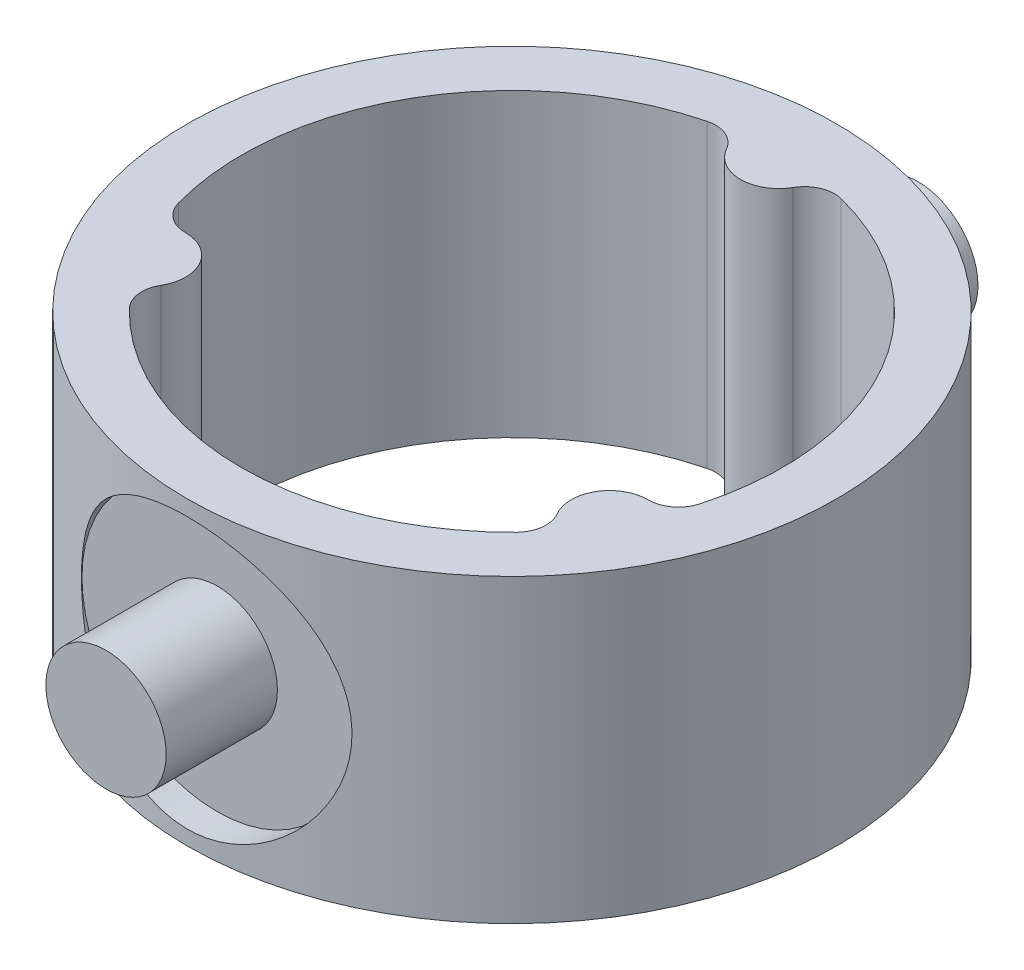
ISO-10303-21;
HEADER;
FILE_DESCRIPTION(('STEP AP214'),'2;1');
FILE_NAME('part.step','',(''),(''),'','','');
FILE_SCHEMA(('AUTOMOTIVE_DESIGN { 1 0 10303 214 1 1 1 1 }'));
ENDSEC;
DATA;
#1=APPLICATION_CONTEXT('core data for automotive mechanical design processes');
#2=APPLICATION_PROTOCOL_DEFINITION('international standard','automotive_design',2000,#1);
#3=PRODUCT_CONTEXT('',#1,'mechanical');
#4=PRODUCT('Part','Part','',(#3));
#5=PRODUCT_RELATED_PRODUCT_CATEGORY('part','',(#4));
#6=PRODUCT_DEFINITION_FORMATION('','',#4);
#7=PRODUCT_DEFINITION_CONTEXT('part definition',#1,'design');
#8=PRODUCT_DEFINITION('design','',#6,#7);
#9=PRODUCT_DEFINITION_SHAPE('','',#8);
#10=(LENGTH_UNIT() NAMED_UNIT(*) SI_UNIT(.MILLI.,.METRE.));
#11=(NAMED_UNIT(*) PLANE_ANGLE_UNIT() SI_UNIT($,.RADIAN.));
#12=(NAMED_UNIT(*) SI_UNIT($,.STERADIAN.) SOLID_ANGLE_UNIT());
#13=UNCERTAINTY_MEASURE_WITH_UNIT(LENGTH_MEASURE(1.E-05),#10,'distance_accuracy_value','');
#14=(GEOMETRIC_REPRESENTATION_CONTEXT(3) GLOBAL_UNCERTAINTY_ASSIGNED_CONTEXT((#13)) GLOBAL_UNIT_ASSIGNED_CONTEXT((#10,
#11,#12)) REPRESENTATION_CONTEXT('',''));
#15=CARTESIAN_POINT('',(0.,0.,0.));
#16=DIRECTION('',(0.,0.,1.));
#17=DIRECTION('',(1.,0.,0.));
#18=AXIS2_PLACEMENT_3D('',#15,#16,#17);
#19=CARTESIAN_POINT('',(0.,-2.5,0.));
#20=DIRECTION('',(0.,1.,0.));
#21=DIRECTION('',(0.,0.,1.));
#22=AXIS2_PLACEMENT_3D('',#19,#20,#21);
#23=CYLINDRICAL_SURFACE('',#22,10.8);
#24=CARTESIAN_POINT('',(0.,7.5,0.));
#25=DIRECTION('',(0.,1.,0.));
#26=DIRECTION('',(0.,0.,1.));
#27=AXIS2_PLACEMENT_3D('',#24,#25,#26);
#28=CIRCLE('',#27,10.8);
#29=CARTESIAN_POINT('',(0.,7.5,10.8));
#30=VERTEX_POINT('',#29);
#31=EDGE_CURVE('E173',#30,#30,#28,.T.);
#32=ORIENTED_EDGE('',*,*,#31,.F.);
#33=EDGE_LOOP('',(#32));
#34=FACE_BOUND('',#33,.T.);
#35=CARTESIAN_POINT('',(0.,-2.5,0.));
#36=DIRECTION('',(0.,1.,0.));
#37=DIRECTION('',(0.,0.,1.));
#38=AXIS2_PLACEMENT_3D('',#35,#36,#37);
#39=CIRCLE('',#38,10.8);
#40=CARTESIAN_POINT('',(0.,-2.5,10.8));
#41=VERTEX_POINT('',#40);
#42=EDGE_CURVE('E176',#41,#41,#39,.T.);
#43=ORIENTED_EDGE('',*,*,#42,.T.);
#44=EDGE_LOOP('',(#43));
#45=FACE_BOUND('',#44,.T.);
#46=CARTESIAN_POINT('',(4.5,2.48878162270595,-9.81784090317214));
#47=CARTESIAN_POINT('',(4.499999130687,2.36872034971407,-9.81784178922771));
#48=CARTESIAN_POINT('',(4.49518786657701,2.24861607583283,-9.82005098185499));
#49=CARTESIAN_POINT('',(4.4759928446243,2.00928289692781,-9.8288145489474));
#50=CARTESIAN_POINT('',(4.46160283761734,1.89005461477417,-9.83537176004558));
#51=CARTESIAN_POINT('',(4.42336403189235,1.65315729466913,-9.85262874117904));
#52=CARTESIAN_POINT('',(4.39949513498688,1.53549212240891,-9.86333731222912));
#53=CARTESIAN_POINT('',(4.34256093138144,1.30280588620721,-9.88853489592547));
#54=CARTESIAN_POINT('',(4.30949175507021,1.18778595693413,-9.90302549912465));
#55=CARTESIAN_POINT('',(4.19727317572978,0.848890394585216,-9.95136091190686));
#56=CARTESIAN_POINT('',(4.10490895957135,0.629938869941857,-9.99016726914596));
#57=CARTESIAN_POINT('',(3.88801174977117,0.210811776086538,-10.0765519108709));
#58=CARTESIAN_POINT('',(3.7634863657861,0.0106317805931158,-10.12412811956));
#59=CARTESIAN_POINT('',(3.47751786827545,-0.377975650228928,-10.2260052021657));
#60=CARTESIAN_POINT('',(3.31438805183078,-0.56510249569064,-10.2805340479398));
#61=CARTESIAN_POINT('',(2.95924162431949,-0.910362280249201,-10.3883210387722));
#62=CARTESIAN_POINT('',(2.767213927272,-1.06848404035776,-10.4415786870417));
#63=CARTESIAN_POINT('',(2.45645909184913,-1.28383997884884,-10.5175053123368));
#64=CARTESIAN_POINT('',(2.34653720651238,-1.35318486540874,-10.5426331121591));
#65=CARTESIAN_POINT('',(2.12070579322386,-1.4823012298353,-10.5903680945871));
#66=CARTESIAN_POINT('',(2.00479873864298,-1.54207662107928,-10.6129763064052));
#67=CARTESIAN_POINT('',(1.76774565997795,-1.65152337780657,-10.6550256866174));
#68=CARTESIAN_POINT('',(1.64659915355632,-1.70119381062872,-10.6744665626417));
#69=CARTESIAN_POINT('',(1.40000523929313,-1.78990291367461,-10.7095976367687));
#70=CARTESIAN_POINT('',(1.27456001192321,-1.82894688672622,-10.7252897051261));
#71=CARTESIAN_POINT('',(1.02687359272432,-1.89426277870306,-10.7517549390501));
#72=CARTESIAN_POINT('',(0.904801371641997,-1.9210900419917,-10.762740238292));
#73=CARTESIAN_POINT('',(0.658605309623306,-1.96451542101854,-10.7806058238914));
#74=CARTESIAN_POINT('',(0.534482407476133,-1.98111809118572,-10.7874879379226));
#75=CARTESIAN_POINT('',(0.28513832143866,-2.00391995217642,-10.7969560406787));
#76=CARTESIAN_POINT('',(0.159917291580193,-2.01012057932942,-10.7995426225367));
#77=CARTESIAN_POINT('',(-0.090617099456184,-2.01204936483073,-10.8003462078145));
#78=CARTESIAN_POINT('',(-0.215930456868742,-2.00777792892519,-10.7985633805297));
#79=CARTESIAN_POINT('',(-0.457987944553301,-1.9893951608201,-10.7909222946683));
#80=CARTESIAN_POINT('',(-0.57478765236829,-1.97590127065178,-10.7853198158807));
#81=CARTESIAN_POINT('',(-0.806783152984606,-1.93986231433349,-10.7704511541539));
#82=CARTESIAN_POINT('',(-0.921978402133852,-1.91731425394038,-10.7611837592306));
#83=CARTESIAN_POINT('',(-1.14991246184237,-1.86339106547157,-10.7392178244333));
#84=CARTESIAN_POINT('',(-1.26265207245534,-1.83201886011533,-10.7265204206965));
#85=CARTESIAN_POINT('',(-1.48500851607678,-1.76073651786461,-10.6980066759271));
#86=CARTESIAN_POINT('',(-1.59462413942044,-1.72082312322955,-10.6821891450108));
#87=CARTESIAN_POINT('',(-1.9209654729284,-1.58743694603114,-10.6300855741452));
#88=CARTESIAN_POINT('',(-2.13190932091022,-1.48109724255699,-10.5894788184313));
#89=CARTESIAN_POINT('',(-2.53339889169575,-1.23776071699913,-10.5006823805653));
#90=CARTESIAN_POINT('',(-2.72393737029233,-1.10075306033037,-10.452490020309));
#91=CARTESIAN_POINT('',(-3.09361197591048,-0.788734734418552,-10.3493437248));
#92=CARTESIAN_POINT('',(-3.27099765235869,-0.611726029513683,-10.2941526262098));
#93=CARTESIAN_POINT('',(-3.59437462400636,-0.230217874793637,-10.1857561525098));
#94=CARTESIAN_POINT('',(-3.74035380458734,-0.0257078659872551,-10.13255155018));
#95=CARTESIAN_POINT('',(-3.93484444183958,0.301574683671118,-10.0579343819606));
#96=CARTESIAN_POINT('',(-3.99637965613973,0.416122295158072,-10.0335773277464));
#97=CARTESIAN_POINT('',(-4.10948974638993,0.650573878972761,-9.98778329616452));
#98=CARTESIAN_POINT('',(-4.16106895689269,0.77047549220087,-9.96634504923679));
#99=CARTESIAN_POINT('',(-4.25376395270496,1.01481785509324,-9.92713597099844));
#100=CARTESIAN_POINT('',(-4.29488113447666,1.13925799642094,-9.90936465028972));
#101=CARTESIAN_POINT('',(-4.36618886300561,1.39170219382132,-9.8781532967137));
#102=CARTESIAN_POINT('',(-4.39638516574454,1.51970433407265,-9.86471098260148));
#103=CARTESIAN_POINT('',(-4.44391709996353,1.76992303041591,-9.84338529706079));
#104=CARTESIAN_POINT('',(-4.46195648046842,1.89198040336973,-9.83519935698869));
#105=CARTESIAN_POINT('',(-4.48794972221711,2.13733236448446,-9.82336567120448));
#106=CARTESIAN_POINT('',(-4.49590814609084,2.26062636746198,-9.81971587245388));
#107=CARTESIAN_POINT('',(-4.5016543912487,2.50748906397633,-9.81708296000969));
#108=CARTESIAN_POINT('',(-4.49944318775422,2.63105773003836,-9.81809939884495));
#109=CARTESIAN_POINT('',(-4.48488101317492,2.87746563868149,-9.82475982928858));
#110=CARTESIAN_POINT('',(-4.47253034506305,3.00030490294706,-9.83040368262717));
#111=CARTESIAN_POINT('',(-4.43895445734497,3.23642544873868,-9.84560811682289));
#112=CARTESIAN_POINT('',(-4.41835116550924,3.34981329340097,-9.85489341541523));
#113=CARTESIAN_POINT('',(-4.36861200004651,3.57435683052016,-9.87704207818052));
#114=CARTESIAN_POINT('',(-4.33947333071349,3.68551177883932,-9.88990661463962));
#115=CARTESIAN_POINT('',(-4.23963907732574,4.0145231100116,-9.93331757979694));
#116=CARTESIAN_POINT('',(-4.15649929560167,4.22810563727014,-9.96869385735817));
#117=CARTESIAN_POINT('',(-3.95558430550482,4.6474315524122,-10.0501501020971));
#118=CARTESIAN_POINT('',(-3.83649140799269,4.85245989529592,-10.096619920115));
#119=CARTESIAN_POINT('',(-3.56832201446919,5.24064224408336,-10.1944800538007));
#120=CARTESIAN_POINT('',(-3.41923254130026,5.4237867277165,-10.2458724940407));
#121=CARTESIAN_POINT('',(-3.08105051623623,5.77846063229159,-10.352829169303));
#122=CARTESIAN_POINT('',(-2.88968944312654,5.94783073276201,-10.4083924290975));
#123=CARTESIAN_POINT('',(-2.47982278026785,6.25249780476487,-10.5135658553975));
#124=CARTESIAN_POINT('',(-2.2613152029377,6.38779227918974,-10.563175585481));
#125=CARTESIAN_POINT('',(-1.91722415243838,6.56197646625842,-10.6291135605005));
#126=CARTESIAN_POINT('',(-1.79956917229354,6.61531789085612,-10.6497107698095));
#127=CARTESIAN_POINT('',(-1.55964717719427,6.71183609549408,-10.6874789596443));
#128=CARTESIAN_POINT('',(-1.43738217267275,6.75501724828375,-10.7046514136199));
#129=CARTESIAN_POINT('',(-1.18916760994523,6.83075349004096,-10.7350602510965));
#130=CARTESIAN_POINT('',(-1.0632190505358,6.86331143091485,-10.748297690906));
#131=CARTESIAN_POINT('',(-0.808609729980778,6.91744765562998,-10.7704443034055));
#132=CARTESIAN_POINT('',(-0.679949172854654,6.93902676234395,-10.7793538004762));
#133=CARTESIAN_POINT('',(-0.430094953099462,6.96982335661635,-10.7921061370254));
#134=CARTESIAN_POINT('',(-0.309010349424316,6.97980157355936,-10.7962604577301));
#135=CARTESIAN_POINT('',(-0.0663153643766298,6.98993218898005,-10.8004784305491));
#136=CARTESIAN_POINT('',(0.0552951799556565,6.99008128555518,-10.8005407080207));
#137=CARTESIAN_POINT('',(0.297995615592964,6.98054515421752,-10.796569876915));
#138=CARTESIAN_POINT('',(0.419085752672342,6.97086523890223,-10.792538980705));
#139=CARTESIAN_POINT('',(0.659935177231045,6.94178132095816,-10.7804931157975));
#140=CARTESIAN_POINT('',(0.779693952141744,6.92237369727812,-10.772476663522));
#141=CARTESIAN_POINT('',(1.01269290930705,6.8749043137203,-10.7530283939932));
#142=CARTESIAN_POINT('',(1.12601270552566,6.84717852597485,-10.7417296296167));
#143=CARTESIAN_POINT('',(1.34983658694246,6.78313978902401,-10.715907013341));
#144=CARTESIAN_POINT('',(1.460339674232,6.74682384206455,-10.701382035681));
#145=CARTESIAN_POINT('',(1.78652819561143,6.62545172133989,-10.6534708536598));
#146=CARTESIAN_POINT('',(1.99708339058819,6.5279320085756,-10.6157316553714));
#147=CARTESIAN_POINT('',(2.40852507201608,6.29760737863984,-10.5302067513327));
#148=CARTESIAN_POINT('',(2.60854454520066,6.16340697756063,-10.4820440889146));
#149=CARTESIAN_POINT('',(2.98409265039456,5.86556812898232,-10.3813786702613));
#150=CARTESIAN_POINT('',(3.15961214750949,5.7019187531233,-10.3288743067662));
#151=CARTESIAN_POINT('',(3.49364238385786,5.3365401766519,-10.2209271583355));
#152=CARTESIAN_POINT('',(3.65018302902976,5.13297752912544,-10.1655275359292));
#153=CARTESIAN_POINT('',(3.8577979853947,4.80910966041488,-10.0877591957318));
#154=CARTESIAN_POINT('',(3.92251430085463,4.69796262635783,-10.0627056516199));
#155=CARTESIAN_POINT('',(4.04237972601622,4.47012125067664,-10.0151543724791));
#156=CARTESIAN_POINT('',(4.0975331944591,4.35342946741121,-9.99265547466616));
#157=CARTESIAN_POINT('',(4.19753634865144,4.11581268701835,-9.95106086139921));
#158=CARTESIAN_POINT('',(4.24243466602216,3.99491094149114,-9.93194918420965));
#159=CARTESIAN_POINT('',(4.32179340568547,3.7492382045854,-9.89767505680287));
#160=CARTESIAN_POINT('',(4.35625894456926,3.62446914307795,-9.88251067121175));
#161=CARTESIAN_POINT('',(4.41430153556168,3.37231894462411,-9.85672104789654));
#162=CARTESIAN_POINT('',(4.4379073361442,3.24494564747837,-9.84608383127355));
#163=CARTESIAN_POINT('',(4.47405247770753,2.98839317650951,-9.82971277973737));
#164=CARTESIAN_POINT('',(4.48660042579225,2.85921548687903,-9.8239751312539));
#165=CARTESIAN_POINT('',(4.49569604617058,2.68961496083608,-9.81981256465333));
#166=CARTESIAN_POINT('',(4.4973095691615,2.64947053417844,-9.8190736773051));
#167=CARTESIAN_POINT('',(4.49946169649934,2.56914621852537,-9.81808769602092));
#168=CARTESIAN_POINT('',(4.5000002909605,2.5289663292072,-9.81784060660788));
#169=CARTESIAN_POINT('',(4.5,2.48878162270595,-9.81784090317214));
#170=B_SPLINE_CURVE_WITH_KNOTS('',3,(#46,#47,#48,#49,#50,#51,#52,#53,#54,#55,#56,#57,#58,#59,
#60,#61,#62,#63,#64,#65,#66,#67,#68,#69,#70,#71,#72,#73,#74,#75,#76,#77,#78,#79,#80,#81,#82,#83,
#84,#85,#86,#87,#88,#89,#90,#91,#92,#93,#94,#95,#96,#97,#98,#99,#100,#101,#102,#103,#104,#105,
#106,#107,#108,#109,#110,#111,#112,#113,#114,#115,#116,#117,#118,#119,#120,#121,#122,#123,#124,
#125,#126,#127,#128,#129,#130,#131,#132,#133,#134,#135,#136,#137,#138,#139,#140,#141,#142,#143,
#144,#145,#146,#147,#148,#149,#150,#151,#152,#153,#154,#155,#156,#157,#158,#159,#160,#161,#162,
#163,#164,#165,#166,#167,#168,#169),.UNSPECIFIED.,.T.,.F.,(4,2,2,2,2,2,2,2,2,2,2,2,2,2,2,2,2,2,
2,2,2,2,2,2,2,2,2,2,2,2,2,2,2,2,2,2,2,2,2,2,2,2,2,2,2,2,2,2,2,2,2,2,2,2,2,2,2,2,2,2,2,4),(0.,
0.360141692400153,0.720518571533897,1.08166367646993,1.44296090824064,2.16182147335641,
2.88051210438917,3.63975741711234,4.39929474216559,4.79599605504564,5.1925347230286,
5.58910997390208,5.9854869609778,6.36139895681738,6.73714338558021,7.1128359267246,
7.48851391167379,7.84122788546848,8.19405859909573,8.54677258602487,8.8996213440283,
9.61535071580285,10.3313333455699,11.0977845351619,11.8645308446497,12.2609771471852,
12.6572504573572,13.0534708455432,13.44948209558,13.8199568081931,14.1902637843756,
14.5605352505301,14.9307956531662,15.2772401588601,15.6237982672733,16.3163751177775,
17.0382823943445,17.7605026575272,18.5415176873689,19.3225899343976,19.7146008882865,
20.1064428197344,20.4981794706219,20.8898867561957,21.2541261375292,21.618487877402,
21.9826527839157,22.3469533482985,22.6981655193966,23.0495004361909,23.7515915016356,
24.4854125567227,25.2195064926379,26.0035528635865,26.396253267933,26.7887742063725,
27.1793932013458,27.5698203118634,27.9592078299316,28.3482919919343,28.4688309030526,
28.5893709227219),.UNSPECIFIED.);
#171=CARTESIAN_POINT('',(4.5,2.48878162270595,-9.81784090317214));
#172=VERTEX_POINT('',#171);
#173=EDGE_CURVE('E226',#172,#172,#170,.T.);
#174=ORIENTED_EDGE('',*,*,#173,.F.);
#175=EDGE_LOOP('',(#174));
#176=FACE_BOUND('',#175,.T.);
#177=CARTESIAN_POINT('',(0.,-2.01121837729405,10.8));
#178=CARTESIAN_POINT('',(-0.120574082460596,-2.01121756003427,10.7999993458434));
#179=CARTESIAN_POINT('',(-0.241188950368004,-2.00636575253238,10.7979752875037));
#180=CARTESIAN_POINT('',(-0.481559849203685,-1.98700373992877,10.7899295249166));
#181=CARTESIAN_POINT('',(-0.60131528816404,-1.97248742305257,10.7839052909898));
#182=CARTESIAN_POINT('',(-0.839275581237151,-1.93390667040113,10.768001771357));
#183=CARTESIAN_POINT('',(-0.957476740688243,-1.90982266302778,10.7581145843111));
#184=CARTESIAN_POINT('',(-1.1912734086126,-1.85234365267924,10.7347417359283));
#185=CARTESIAN_POINT('',(-1.30686783122598,-1.81894484424346,10.72125460397));
#186=CARTESIAN_POINT('',(-1.5341993911699,-1.7433008830199,10.6910861666311));
#187=CARTESIAN_POINT('',(-1.64594959716117,-1.7010900737902,10.6744172826815));
#188=CARTESIAN_POINT('',(-1.86537837610477,-1.6081178179564,10.638268514392));
#189=CARTESIAN_POINT('',(-1.97305540815876,-1.55735317424117,10.6187875794017));
#190=CARTESIAN_POINT('',(-2.28885932275931,-1.39288497014229,10.5568449178338));
#191=CARTESIAN_POINT('',(-2.49006383986557,-1.26690486813539,10.5108409721634));
#192=CARTESIAN_POINT('',(-2.87804584264689,-0.979348518645932,10.4114794226615));
#193=CARTESIAN_POINT('',(-3.0637380245867,-0.81640440635858,10.3578812833438));
#194=CARTESIAN_POINT('',(-3.40618589993601,-0.462236015237614,10.2503715396276));
#195=CARTESIAN_POINT('',(-3.56292635744277,-0.270996940919809,10.196459785494));
#196=CARTESIAN_POINT('',(-3.7767844507323,0.0387329262644708,10.1184024246455));
#197=CARTESIAN_POINT('',(-3.84586849552686,0.148653244156109,10.0922773256918));
#198=CARTESIAN_POINT('',(-3.97446736749641,0.374435059284382,10.0423283818193));
#199=CARTESIAN_POINT('',(-4.0339861542166,0.490294071862373,10.0185035863273));
#200=CARTESIAN_POINT('',(-4.14294141890078,0.727235202258029,9.97394137396134));
#201=CARTESIAN_POINT('',(-4.19237745515302,0.848317548621528,9.95320409235785));
#202=CARTESIAN_POINT('',(-4.28064868825705,1.09480538874047,9.91556104229413));
#203=CARTESIAN_POINT('',(-4.31948933505338,1.22020862243309,9.89865330479588));
#204=CARTESIAN_POINT('',(-4.38456242952077,1.46835438758209,9.86999575864018));
#205=CARTESIAN_POINT('',(-4.41130804691534,1.59093836746799,9.8580383340799));
#206=CARTESIAN_POINT('',(-4.4544915347756,1.83820704584183,9.83860091686521));
#207=CARTESIAN_POINT('',(-4.47093416889249,1.96289074608684,9.83111885507054));
#208=CARTESIAN_POINT('',(-4.49332253950478,2.21336003390348,9.82090652821701));
#209=CARTESIAN_POINT('',(-4.49927098369659,2.33914532882298,9.81817503742496));
#210=CARTESIAN_POINT('',(-4.50060293062115,2.59077837044722,9.81756455982488));
#211=CARTESIAN_POINT('',(-4.49598698947528,2.71662611351596,9.81968531758891));
#212=CARTESIAN_POINT('',(-4.47700900230672,2.95767027146309,9.82835132197387));
#213=CARTESIAN_POINT('',(-4.46342430202013,3.07294108132158,9.83454352354727));
#214=CARTESIAN_POINT('',(-4.42745811178658,3.30183722179444,9.85078629077822));
#215=CARTESIAN_POINT('',(-4.40507374501833,3.41546200167377,9.86083811821468));
#216=CARTESIAN_POINT('',(-4.32502840324777,3.75265594589069,9.8963445279658));
#217=CARTESIAN_POINT('',(-4.25445908543001,3.97274417063242,9.92715801478711));
#218=CARTESIAN_POINT('',(-4.07958567017749,4.40242506294458,10.0003028872635));
#219=CARTESIAN_POINT('',(-3.97459567371488,4.61169473396364,10.0428654134389));
#220=CARTESIAN_POINT('',(-3.73432603511191,5.01049186491548,10.1346598577841));
#221=CARTESIAN_POINT('',(-3.59903444790385,5.20001149597519,10.1838944030725));
#222=CARTESIAN_POINT('',(-3.28858508332836,5.57074436863949,10.2885471866942));
#223=CARTESIAN_POINT('',(-3.11102443428177,5.74990204160969,10.3441363756894));
#224=CARTESIAN_POINT('',(-2.7278266330754,6.07658945686123,10.4517242269214));
#225=CARTESIAN_POINT('',(-2.52218292241034,6.22411179029312,10.5037220461474));
#226=CARTESIAN_POINT('',(-2.08241258624484,6.48635080308796,10.5997782094909));
#227=CARTESIAN_POINT('',(-1.84773808947183,6.60023168388703,10.6436255960897));
#228=CARTESIAN_POINT('',(-1.36026865643235,6.78617766667151,10.7168213304035));
#229=CARTESIAN_POINT('',(-1.10748382157786,6.85826587846898,10.7461776897881));
#230=CARTESIAN_POINT('',(-0.608141207750658,6.95427921238012,10.7855870833287));
#231=CARTESIAN_POINT('',(-0.362200632294698,6.98096192786966,10.7967434796293));
#232=CARTESIAN_POINT('',(0.130876765075994,6.99362800935575,10.8020178113426));
#233=CARTESIAN_POINT('',(0.378013223202344,6.97962306018785,10.7961406385207));
#234=CARTESIAN_POINT('',(0.853553652040939,6.91328577007884,10.7687238424062));
#235=CARTESIAN_POINT('',(1.08227860515053,6.86288997684305,10.7479759668333));
#236=CARTESIAN_POINT('',(1.52777797105663,6.72789593344825,10.6937498191942));
#237=CARTESIAN_POINT('',(1.74455087013444,6.64329336228167,10.6602699388502));
#238=CARTESIAN_POINT('',(2.16759211220403,6.43952683498352,10.5824978377736));
#239=CARTESIAN_POINT('',(2.37332496500643,6.31937090694797,10.5379020507931));
#240=CARTESIAN_POINT('',(2.76244746656075,6.04898671794073,10.4426566067986));
#241=CARTESIAN_POINT('',(2.9458277352223,5.89874590149194,10.392004425807));
#242=CARTESIAN_POINT('',(3.29879599256221,5.5599409715669,10.285636597715));
#243=CARTESIAN_POINT('',(3.46646171356857,5.36940538610698,10.2298177850298));
#244=CARTESIAN_POINT('',(3.76802824894943,4.96186264557471,10.1226305946415));
#245=CARTESIAN_POINT('',(3.90192139538208,4.7448494954311,10.0712632293581));
#246=CARTESIAN_POINT('',(4.07512574896637,4.4019295459753,10.0018642819867));
#247=CARTESIAN_POINT('',(4.12855099241518,4.28376099291936,9.97987011352927));
#248=CARTESIAN_POINT('',(4.22516253630493,4.04275287961812,9.93935352296125));
#249=CARTESIAN_POINT('',(4.26835334334903,3.91991540302732,9.92082957353939));
#250=CARTESIAN_POINT('',(4.34401970268368,3.67050652854582,9.88793188480419));
#251=CARTESIAN_POINT('',(4.37650018530481,3.54393687801804,9.87355623626702));
#252=CARTESIAN_POINT('',(4.43038424760336,3.28802292334045,9.84949592581877));
#253=CARTESIAN_POINT('',(4.4517888690532,3.15867888133638,9.83981082273025));
#254=CARTESIAN_POINT('',(4.48202687255038,2.90839717082882,9.82607177900605));
#255=CARTESIAN_POINT('',(4.491703145897,2.78758134984083,9.82164085226429));
#256=CARTESIAN_POINT('',(4.50127476076263,2.54543705541208,9.81725800630024));
#257=CARTESIAN_POINT('',(4.50116682858521,2.42410842396782,9.81730758621024));
#258=CARTESIAN_POINT('',(4.49116467704502,2.18200617598769,9.82188725710472));
#259=CARTESIAN_POINT('',(4.48127559876716,2.06123230136801,9.82641499431725));
#260=CARTESIAN_POINT('',(4.45183127868416,1.8210677248557,9.83978955872549));
#261=CARTESIAN_POINT('',(4.43227239356962,1.70167756167186,9.84863801382988));
#262=CARTESIAN_POINT('',(4.38484739739312,1.47077320069273,9.86984063744414));
#263=CARTESIAN_POINT('',(4.35741530324562,1.35915268816209,9.88201033227098));
#264=CARTESIAN_POINT('',(4.2942321082673,1.13869342047709,9.90962924266346));
#265=CARTESIAN_POINT('',(4.25847813694366,1.02985563958928,9.9250795896737));
#266=CARTESIAN_POINT('',(4.13918053256737,0.708527447818413,9.97570545284133));
#267=CARTESIAN_POINT('',(4.04356744713983,0.501059752712437,10.0151717018636));
#268=CARTESIAN_POINT('',(3.81635829247831,0.0922405167870214,10.1040133864555));
#269=CARTESIAN_POINT('',(3.68294431479189,-0.107993196968912,10.1538419564375));
#270=CARTESIAN_POINT('',(3.38647534385777,-0.484300442911821,10.2565305464088));
#271=CARTESIAN_POINT('',(3.22341007288603,-0.660365560534364,10.3093916131588));
#272=CARTESIAN_POINT('',(2.85800581524318,-0.996577071602383,10.416836596008));
#273=CARTESIAN_POINT('',(2.65367141027522,-1.15463009543404,10.4712655834305));
#274=CARTESIAN_POINT('',(2.32825162147272,-1.36426685728298,10.5466464125933));
#275=CARTESIAN_POINT('',(2.21652567458091,-1.42961438763484,10.5707468108104));
#276=CARTESIAN_POINT('',(1.98743544023867,-1.55063054324843,10.6161999011848));
#277=CARTESIAN_POINT('',(1.87007378424898,-1.60630363073967,10.6375538589199));
#278=CARTESIAN_POINT('',(1.63241825785586,-1.70664297489514,10.67658588495));
#279=CARTESIAN_POINT('',(1.51220149333641,-1.75147128965452,10.6943173660995));
#280=CARTESIAN_POINT('',(1.26797492119147,-1.83079134594822,10.7260145434384));
#281=CARTESIAN_POINT('',(1.14396694352134,-1.86528799023325,10.739982025465));
#282=CARTESIAN_POINT('',(0.893386646731148,-1.92351576780858,10.7637197608376));
#283=CARTESIAN_POINT('',(0.766821479844887,-1.94727348721823,10.7735003762985));
#284=CARTESIAN_POINT('',(0.511922254516761,-1.98385646477143,10.7886148838032));
#285=CARTESIAN_POINT('',(0.383589565012367,-1.99668974782812,10.7939520398764));
#286=CARTESIAN_POINT('',(0.212499822285201,-2.00639957257543,10.7979929640834));
#287=CARTESIAN_POINT('',(0.170025127077283,-2.00820613388554,10.7987451957735));
#288=CARTESIAN_POINT('',(0.0850353120228752,-2.01061568207058,10.7997488297924));
#289=CARTESIAN_POINT('',(0.0425201920609744,-2.01121866549896,10.8000002306869));
#290=CARTESIAN_POINT('',(0.,-2.01121837729405,10.8));
#291=B_SPLINE_CURVE_WITH_KNOTS('',3,(#177,#178,#179,#180,#181,#182,#183,#184,#185,#186,#187,
#188,#189,#190,#191,#192,#193,#194,#195,#196,#197,#198,#199,#200,#201,#202,#203,#204,#205,#206,
#207,#208,#209,#210,#211,#212,#213,#214,#215,#216,#217,#218,#219,#220,#221,#222,#223,#224,#225,
#226,#227,#228,#229,#230,#231,#232,#233,#234,#235,#236,#237,#238,#239,#240,#241,#242,#243,#244,
#245,#246,#247,#248,#249,#250,#251,#252,#253,#254,#255,#256,#257,#258,#259,#260,#261,#262,#263,
#264,#265,#266,#267,#268,#269,#270,#271,#272,#273,#274,#275,#276,#277,#278,#279,#280,#281,#282,
#283,#284,#285,#286,#287,#288,#289,#290),.UNSPECIFIED.,.T.,.F.,(4,2,2,2,2,2,2,2,2,2,2,2,2,2,2,2,
2,2,2,2,2,2,2,2,2,2,2,2,2,2,2,2,2,2,2,2,2,2,2,2,2,2,2,2,2,2,2,2,2,2,2,2,2,2,2,2,4),(0.,
0.36167896007413,0.723586861163467,1.08623892225324,1.44903935847162,1.81045137967541,
2.17199878436342,2.89413209017144,3.64939382389778,4.40505189023349,4.80192787576723,
5.19863914867557,5.59536779724044,5.99189199427438,6.36949609148927,6.74692547192359,
7.12425745429923,7.50156957394274,7.84984570078445,8.19823578223054,8.8944225931685,
9.60542379310257,10.3167057688083,11.0880992035931,11.859673098314,12.6490561051781,
13.4380021948475,14.1770540851459,14.915893752743,15.6180673534748,16.3203296806531,
17.0444069927867,17.7687871198907,18.5449356920435,19.3212603276411,19.7154336025095,
20.1094329843294,20.5032507406616,20.8970314485803,21.2604139968556,21.6239181297129,
21.9872313020204,22.3506814648831,22.6970361550415,23.0435104919915,23.7359649114821,
24.4700552555679,25.204400536594,25.9922303534361,26.3867945518146,26.7811762759773,
27.1692392938598,27.5571178689855,27.9440308505505,28.3306593662665,28.4582043120368,
28.5857496230433),.UNSPECIFIED.);
#292=CARTESIAN_POINT('',(0.,-2.01121837729405,10.8));
#293=VERTEX_POINT('',#292);
#294=EDGE_CURVE('E39',#293,#293,#291,.T.);
#295=ORIENTED_EDGE('',*,*,#294,.T.);
#296=EDGE_LOOP('',(#295));
#297=FACE_BOUND('',#296,.T.);
#298=ADVANCED_FACE('F35',(#34,#45,#176,#297),#23,.T.);
#299=CARTESIAN_POINT('',(0.,-2.5,0.));
#300=DIRECTION('',(0.,1.,0.));
#301=DIRECTION('',(0.,0.,1.));
#302=AXIS2_PLACEMENT_3D('',#299,#300,#301);
#303=PLANE('',#302);
#304=ORIENTED_EDGE('',*,*,#42,.F.);
#305=EDGE_LOOP('',(#304));
#306=FACE_BOUND('',#305,.T.);
#307=CARTESIAN_POINT('',(7.68600342189929,-2.5,4.43751614462594));
#308=DIRECTION('',(0.,-1.,0.));
#309=DIRECTION('',(0.,0.,1.));
#310=AXIS2_PLACEMENT_3D('',#307,#308,#309);
#311=CIRCLE('',#310,1.27503228925188);
#312=CARTESIAN_POINT('',(6.58616787272934,-2.5,5.08255033241518));
#313=VERTEX_POINT('',#312);
#314=CARTESIAN_POINT('',(7.69470164024926,-2.5,3.16251352516493));
#315=VERTEX_POINT('',#314);
#316=EDGE_CURVE('E291',#313,#315,#311,.T.);
#317=ORIENTED_EDGE('',*,*,#316,.T.);
#318=CARTESIAN_POINT('',(7.70152359952298,-2.5,2.16253679499984));
#319=DIRECTION('',(0.,1.,0.));
#320=DIRECTION('',(0.,0.,1.));
#321=AXIS2_PLACEMENT_3D('',#318,#319,#320);
#322=CIRCLE('',#321,1.);
#323=CARTESIAN_POINT('',(8.66428903418213,-2.5,2.43287494958699));
#324=VERTEX_POINT('',#323);
#325=EDGE_CURVE('E141',#315,#324,#322,.T.);
#326=ORIENTED_EDGE('',*,*,#325,.T.);
#327=CARTESIAN_POINT('',(0.,-2.5,0.));
#328=DIRECTION('',(0.,1.,0.));
#329=DIRECTION('',(0.,0.,1.));
#330=AXIS2_PLACEMENT_3D('',#327,#328,#329);
#331=CIRCLE('',#330,8.99937692221948);
#332=CARTESIAN_POINT('',(2.22521300651794,-2.5,-8.71993188412616));
#333=VERTEX_POINT('',#332);
#334=EDGE_CURVE('E149',#324,#333,#331,.T.);
#335=ORIENTED_EDGE('',*,*,#334,.T.);
#336=CARTESIAN_POINT('',(1.97794999867305,-2.5,-7.75098348253219));
#337=DIRECTION('',(0.,1.,0.));
#338=DIRECTION('',(0.,0.,1.));
#339=AXIS2_PLACEMENT_3D('',#336,#337,#338);
#340=CIRCLE('',#339,1.);
#341=CARTESIAN_POINT('',(1.10853376751992,-2.5,-8.24506385758011));
#342=VERTEX_POINT('',#341);
#343=EDGE_CURVE('E11',#333,#342,#340,.T.);
#344=ORIENTED_EDGE('',*,*,#343,.T.);
#345=CARTESIAN_POINT('',(0.,-2.5,-8.87503228925188));
#346=DIRECTION('',(0.,-1.,0.));
#347=DIRECTION('',(0.,0.,1.));
#348=AXIS2_PLACEMENT_3D('',#345,#346,#347);
#349=CIRCLE('',#348,1.27503228925188);
#350=CARTESIAN_POINT('',(-1.10853376751992,-2.5,-8.24506385758011));
#351=VERTEX_POINT('',#350);
#352=EDGE_CURVE('E170',#342,#351,#349,.T.);
#353=ORIENTED_EDGE('',*,*,#352,.T.);
#354=CARTESIAN_POINT('',(-1.97794999867304,-2.5,-7.75098348253219));
#355=DIRECTION('',(0.,1.,0.));
#356=DIRECTION('',(0.,0.,1.));
#357=AXIS2_PLACEMENT_3D('',#354,#355,#356);
#358=CIRCLE('',#357,1.);
#359=CARTESIAN_POINT('',(-2.22521300651794,-2.5,-8.71993188412616));
#360=VERTEX_POINT('',#359);
#361=EDGE_CURVE('E224',#351,#360,#358,.T.);
#362=ORIENTED_EDGE('',*,*,#361,.T.);
#363=CARTESIAN_POINT('',(0.,-2.5,0.));
#364=DIRECTION('',(0.,1.,0.));
#365=DIRECTION('',(0.,0.,1.));
#366=AXIS2_PLACEMENT_3D('',#363,#364,#365);
#367=CIRCLE('',#366,8.99937692221948);
#368=CARTESIAN_POINT('',(-8.66428903418213,-2.5,2.43287494958699));
#369=VERTEX_POINT('',#368);
#370=EDGE_CURVE('E155',#360,#369,#367,.T.);
#371=ORIENTED_EDGE('',*,*,#370,.T.);
#372=CARTESIAN_POINT('',(-7.70152359952298,-2.5,2.16253679499984));
#373=DIRECTION('',(0.,1.,0.));
#374=DIRECTION('',(0.,0.,1.));
#375=AXIS2_PLACEMENT_3D('',#372,#373,#374);
#376=CIRCLE('',#375,1.);
#377=CARTESIAN_POINT('',(-7.69470164024926,-2.5,3.16251352516493));
#378=VERTEX_POINT('',#377);
#379=EDGE_CURVE('E220',#369,#378,#376,.T.);
#380=ORIENTED_EDGE('',*,*,#379,.T.);
#381=CARTESIAN_POINT('',(-7.6860034218993,-2.5,4.43751614462594));
#382=DIRECTION('',(0.,-1.,0.));
#383=DIRECTION('',(0.,0.,1.));
#384=AXIS2_PLACEMENT_3D('',#381,#382,#383);
#385=CIRCLE('',#384,1.27503228925188);
#386=CARTESIAN_POINT('',(-6.58616787272934,-2.5,5.08255033241517));
#387=VERTEX_POINT('',#386);
#388=EDGE_CURVE('E159',#378,#387,#385,.T.);
#389=ORIENTED_EDGE('',*,*,#388,.T.);
#390=CARTESIAN_POINT('',(-5.72357360084994,-2.5,5.58844668753235));
#391=DIRECTION('',(0.,1.,0.));
#392=DIRECTION('',(0.,0.,1.));
#393=AXIS2_PLACEMENT_3D('',#390,#391,#392);
#394=CIRCLE('',#393,1.);
#395=CARTESIAN_POINT('',(-6.43907602766419,-2.5,6.28705693453916));
#396=VERTEX_POINT('',#395);
#397=EDGE_CURVE('E216',#387,#396,#394,.T.);
#398=ORIENTED_EDGE('',*,*,#397,.T.);
#399=CARTESIAN_POINT('',(0.,-2.5,0.));
#400=DIRECTION('',(0.,1.,0.));
#401=DIRECTION('',(0.,0.,1.));
#402=AXIS2_PLACEMENT_3D('',#399,#400,#401);
#403=CIRCLE('',#402,8.99937692221948);
#404=CARTESIAN_POINT('',(6.43907602766418,-2.5,6.28705693453917));
#405=VERTEX_POINT('',#404);
#406=EDGE_CURVE('E295',#396,#405,#403,.T.);
#407=ORIENTED_EDGE('',*,*,#406,.T.);
#408=CARTESIAN_POINT('',(5.72357360084994,-2.5,5.58844668753235));
#409=DIRECTION('',(0.,1.,0.));
#410=DIRECTION('',(0.,0.,1.));
#411=AXIS2_PLACEMENT_3D('',#408,#409,#410);
#412=CIRCLE('',#411,1.);
#413=EDGE_CURVE('E212',#405,#313,#412,.T.);
#414=ORIENTED_EDGE('',*,*,#413,.T.);
#415=EDGE_LOOP('',(#317,#326,#335,#344,#353,#362,#371,#380,#389,#398,#407,#414));
#416=FACE_BOUND('',#415,.T.);
#417=ADVANCED_FACE('F280',(#306,#416),#303,.F.);
#418=CARTESIAN_POINT('',(0.,7.5,0.));
#419=DIRECTION('',(0.,1.,0.));
#420=DIRECTION('',(0.,0.,1.));
#421=AXIS2_PLACEMENT_3D('',#418,#419,#420);
#422=PLANE('',#421);
#423=ORIENTED_EDGE('',*,*,#31,.T.);
#424=EDGE_LOOP('',(#423));
#425=FACE_BOUND('',#424,.T.);
#426=CARTESIAN_POINT('',(0.,7.5,-8.87503228925188));
#427=DIRECTION('',(0.,1.,0.));
#428=DIRECTION('',(0.,0.,1.));
#429=AXIS2_PLACEMENT_3D('',#426,#427,#428);
#430=CIRCLE('',#429,1.27503228925188);
#431=CARTESIAN_POINT('',(1.10853376751992,7.5,-8.24506385758011));
#432=VERTEX_POINT('',#431);
#433=CARTESIAN_POINT('',(-1.10853376751992,7.5,-8.24506385758011));
#434=VERTEX_POINT('',#433);
#435=EDGE_CURVE('E184',#432,#434,#430,.F.);
#436=ORIENTED_EDGE('',*,*,#435,.F.);
#437=CARTESIAN_POINT('',(1.97794999867305,7.5,-7.75098348253219));
#438=DIRECTION('',(0.,1.,0.));
#439=DIRECTION('',(0.,0.,1.));
#440=AXIS2_PLACEMENT_3D('',#437,#438,#439);
#441=CIRCLE('',#440,1.);
#442=CARTESIAN_POINT('',(2.22521300651794,7.5,-8.71993188412616));
#443=VERTEX_POINT('',#442);
#444=EDGE_CURVE('E49',#432,#443,#441,.F.);
#445=ORIENTED_EDGE('',*,*,#444,.T.);
#446=CARTESIAN_POINT('',(0.,7.5,0.));
#447=DIRECTION('',(0.,1.,0.));
#448=DIRECTION('',(0.,0.,1.));
#449=AXIS2_PLACEMENT_3D('',#446,#447,#448);
#450=CIRCLE('',#449,8.99937692221948);
#451=CARTESIAN_POINT('',(8.66428903418213,7.5,2.43287494958699));
#452=VERTEX_POINT('',#451);
#453=EDGE_CURVE('E147',#452,#443,#450,.T.);
#454=ORIENTED_EDGE('',*,*,#453,.F.);
#455=CARTESIAN_POINT('',(7.70152359952298,7.5,2.16253679499984));
#456=DIRECTION('',(0.,1.,0.));
#457=DIRECTION('',(0.,0.,1.));
#458=AXIS2_PLACEMENT_3D('',#455,#456,#457);
#459=CIRCLE('',#458,1.);
#460=CARTESIAN_POINT('',(7.69470164024926,7.5,3.16251352516493));
#461=VERTEX_POINT('',#460);
#462=EDGE_CURVE('E131',#452,#461,#459,.F.);
#463=ORIENTED_EDGE('',*,*,#462,.T.);
#464=CARTESIAN_POINT('',(7.68600342189929,7.5,4.43751614462594));
#465=DIRECTION('',(0.,1.,0.));
#466=DIRECTION('',(0.,0.,1.));
#467=AXIS2_PLACEMENT_3D('',#464,#465,#466);
#468=CIRCLE('',#467,1.27503228925188);
#469=CARTESIAN_POINT('',(6.58616787272934,7.5,5.08255033241518));
#470=VERTEX_POINT('',#469);
#471=EDGE_CURVE('E182',#470,#461,#468,.F.);
#472=ORIENTED_EDGE('',*,*,#471,.F.);
#473=CARTESIAN_POINT('',(5.72357360084994,7.5,5.58844668753235));
#474=DIRECTION('',(0.,1.,0.));
#475=DIRECTION('',(0.,0.,1.));
#476=AXIS2_PLACEMENT_3D('',#473,#474,#475);
#477=CIRCLE('',#476,1.);
#478=CARTESIAN_POINT('',(6.43907602766418,7.5,6.28705693453917));
#479=VERTEX_POINT('',#478);
#480=EDGE_CURVE('E210',#470,#479,#477,.F.);
#481=ORIENTED_EDGE('',*,*,#480,.T.);
#482=CARTESIAN_POINT('',(0.,7.5,0.));
#483=DIRECTION('',(0.,1.,0.));
#484=DIRECTION('',(0.,0.,1.));
#485=AXIS2_PLACEMENT_3D('',#482,#483,#484);
#486=CIRCLE('',#485,8.99937692221948);
#487=CARTESIAN_POINT('',(-6.43907602766419,7.5,6.28705693453916));
#488=VERTEX_POINT('',#487);
#489=EDGE_CURVE('E156',#488,#479,#486,.T.);
#490=ORIENTED_EDGE('',*,*,#489,.F.);
#491=CARTESIAN_POINT('',(-5.72357360084994,7.5,5.58844668753235));
#492=DIRECTION('',(0.,1.,0.));
#493=DIRECTION('',(0.,0.,1.));
#494=AXIS2_PLACEMENT_3D('',#491,#492,#493);
#495=CIRCLE('',#494,1.);
#496=CARTESIAN_POINT('',(-6.58616787272934,7.5,5.08255033241517));
#497=VERTEX_POINT('',#496);
#498=EDGE_CURVE('E214',#488,#497,#495,.F.);
#499=ORIENTED_EDGE('',*,*,#498,.T.);
#500=CARTESIAN_POINT('',(-7.6860034218993,7.5,4.43751614462594));
#501=DIRECTION('',(0.,1.,0.));
#502=DIRECTION('',(0.,0.,1.));
#503=AXIS2_PLACEMENT_3D('',#500,#501,#502);
#504=CIRCLE('',#503,1.27503228925188);
#505=CARTESIAN_POINT('',(-7.69470164024926,7.5,3.16251352516493));
#506=VERTEX_POINT('',#505);
#507=EDGE_CURVE('E179',#506,#497,#504,.F.);
#508=ORIENTED_EDGE('',*,*,#507,.F.);
#509=CARTESIAN_POINT('',(-7.70152359952298,7.5,2.16253679499984));
#510=DIRECTION('',(0.,1.,0.));
#511=DIRECTION('',(0.,0.,1.));
#512=AXIS2_PLACEMENT_3D('',#509,#510,#511);
#513=CIRCLE('',#512,1.);
#514=CARTESIAN_POINT('',(-8.66428903418213,7.5,2.43287494958699));
#515=VERTEX_POINT('',#514);
#516=EDGE_CURVE('E218',#506,#515,#513,.F.);
#517=ORIENTED_EDGE('',*,*,#516,.T.);
#518=CARTESIAN_POINT('',(0.,7.5,0.));
#519=DIRECTION('',(0.,1.,0.));
#520=DIRECTION('',(0.,0.,1.));
#521=AXIS2_PLACEMENT_3D('',#518,#519,#520);
#522=CIRCLE('',#521,8.99937692221948);
#523=CARTESIAN_POINT('',(-2.22521300651794,7.5,-8.71993188412616));
#524=VERTEX_POINT('',#523);
#525=EDGE_CURVE('E162',#524,#515,#522,.T.);
#526=ORIENTED_EDGE('',*,*,#525,.F.);
#527=CARTESIAN_POINT('',(-1.97794999867304,7.5,-7.75098348253219));
#528=DIRECTION('',(0.,1.,0.));
#529=DIRECTION('',(0.,0.,1.));
#530=AXIS2_PLACEMENT_3D('',#527,#528,#529);
#531=CIRCLE('',#530,1.);
#532=EDGE_CURVE('E222',#524,#434,#531,.F.);
#533=ORIENTED_EDGE('',*,*,#532,.T.);
#534=EDGE_LOOP('',(#436,#445,#454,#463,#472,#481,#490,#499,#508,#517,#526,#533));
#535=FACE_BOUND('',#534,.T.);
#536=ADVANCED_FACE('F154',(#425,#535),#422,.T.);
#537=CARTESIAN_POINT('',(7.68600342189929,-2.5,4.43751614462594));
#538=DIRECTION('',(0.,1.,0.));
#539=DIRECTION('',(0.,0.,1.));
#540=AXIS2_PLACEMENT_3D('',#537,#538,#539);
#541=CYLINDRICAL_SURFACE('',#540,1.27503228925188);
#542=ORIENTED_EDGE('',*,*,#471,.T.);
#543=DIRECTION('',(0.,1.,0.));
#544=VECTOR('',#543,1.);
#545=CARTESIAN_POINT('',(7.69470164024926,-2.5,3.16251352516493));
#546=LINE('',#545,#544);
#547=EDGE_CURVE('E136',#461,#315,#546,.F.);
#548=ORIENTED_EDGE('',*,*,#547,.T.);
#549=ORIENTED_EDGE('',*,*,#316,.F.);
#550=DIRECTION('',(0.,1.,0.));
#551=VECTOR('',#550,1.);
#552=CARTESIAN_POINT('',(6.58616787272934,-2.5,5.08255033241518));
#553=LINE('',#552,#551);
#554=EDGE_CURVE('E150',#313,#470,#553,.T.);
#555=ORIENTED_EDGE('',*,*,#554,.T.);
#556=EDGE_LOOP('',(#542,#548,#549,#555));
#557=FACE_BOUND('',#556,.T.);
#558=ADVANCED_FACE('F250',(#557),#541,.T.);
#559=CARTESIAN_POINT('',(-7.6860034218993,-2.5,4.43751614462594));
#560=DIRECTION('',(0.,1.,0.));
#561=DIRECTION('',(0.,0.,1.));
#562=AXIS2_PLACEMENT_3D('',#559,#560,#561);
#563=CYLINDRICAL_SURFACE('',#562,1.27503228925188);
#564=ORIENTED_EDGE('',*,*,#507,.T.);
#565=DIRECTION('',(0.,1.,0.));
#566=VECTOR('',#565,1.);
#567=CARTESIAN_POINT('',(-6.58616787272934,-2.5,5.08255033241517));
#568=LINE('',#567,#566);
#569=EDGE_CURVE('E198',#497,#387,#568,.F.);
#570=ORIENTED_EDGE('',*,*,#569,.T.);
#571=ORIENTED_EDGE('',*,*,#388,.F.);
#572=DIRECTION('',(0.,1.,0.));
#573=VECTOR('',#572,1.);
#574=CARTESIAN_POINT('',(-7.69470164024926,-2.5,3.16251352516493));
#575=LINE('',#574,#573);
#576=EDGE_CURVE('E195',#378,#506,#575,.T.);
#577=ORIENTED_EDGE('',*,*,#576,.T.);
#578=EDGE_LOOP('',(#564,#570,#571,#577));
#579=FACE_BOUND('',#578,.T.);
#580=ADVANCED_FACE('F253',(#579),#563,.T.);
#581=CARTESIAN_POINT('',(0.,-2.5,0.));
#582=DIRECTION('',(0.,1.,0.));
#583=DIRECTION('',(0.,0.,1.));
#584=AXIS2_PLACEMENT_3D('',#581,#582,#583);
#585=CYLINDRICAL_SURFACE('',#584,8.99937692221948);
#586=ORIENTED_EDGE('',*,*,#525,.T.);
#587=DIRECTION('',(0.,1.,0.));
#588=VECTOR('',#587,1.);
#589=CARTESIAN_POINT('',(-8.66428903418213,-2.5,2.43287494958699));
#590=LINE('',#589,#588);
#591=EDGE_CURVE('E203',#515,#369,#590,.F.);
#592=ORIENTED_EDGE('',*,*,#591,.T.);
#593=ORIENTED_EDGE('',*,*,#370,.F.);
#594=DIRECTION('',(0.,1.,0.));
#595=VECTOR('',#594,1.);
#596=CARTESIAN_POINT('',(-2.22521300651794,-2.5,-8.71993188412616));
#597=LINE('',#596,#595);
#598=EDGE_CURVE('E200',#360,#524,#597,.T.);
#599=ORIENTED_EDGE('',*,*,#598,.T.);
#600=EDGE_LOOP('',(#586,#592,#593,#599));
#601=FACE_BOUND('',#600,.T.);
#602=ADVANCED_FACE('F246',(#601),#585,.F.);
#603=CARTESIAN_POINT('',(0.,-2.5,-8.87503228925188));
#604=DIRECTION('',(0.,1.,0.));
#605=DIRECTION('',(0.,0.,1.));
#606=AXIS2_PLACEMENT_3D('',#603,#604,#605);
#607=CYLINDRICAL_SURFACE('',#606,1.27503228925188);
#608=ORIENTED_EDGE('',*,*,#435,.T.);
#609=DIRECTION('',(0.,1.,0.));
#610=VECTOR('',#609,1.);
#611=CARTESIAN_POINT('',(-1.10853376751992,-2.5,-8.24506385758011));
#612=LINE('',#611,#610);
#613=EDGE_CURVE('E57',#434,#351,#612,.F.);
#614=ORIENTED_EDGE('',*,*,#613,.T.);
#615=ORIENTED_EDGE('',*,*,#352,.F.);
#616=DIRECTION('',(0.,1.,0.));
#617=VECTOR('',#616,1.);
#618=CARTESIAN_POINT('',(1.10853376751992,-2.5,-8.24506385758011));
#619=LINE('',#618,#617);
#620=EDGE_CURVE('E205',#342,#432,#619,.T.);
#621=ORIENTED_EDGE('',*,*,#620,.T.);
#622=EDGE_LOOP('',(#608,#614,#615,#621));
#623=FACE_BOUND('',#622,.T.);
#624=ADVANCED_FACE('F243',(#623),#607,.T.);
#625=CARTESIAN_POINT('',(0.,-2.5,0.));
#626=DIRECTION('',(0.,1.,0.));
#627=DIRECTION('',(0.,0.,1.));
#628=AXIS2_PLACEMENT_3D('',#625,#626,#627);
#629=CYLINDRICAL_SURFACE('',#628,8.99937692221948);
#630=ORIENTED_EDGE('',*,*,#334,.F.);
#631=DIRECTION('',(0.,1.,0.));
#632=VECTOR('',#631,1.);
#633=CARTESIAN_POINT('',(8.66428903418213,-2.5,2.43287494958699));
#634=LINE('',#633,#632);
#635=EDGE_CURVE('E135',#324,#452,#634,.T.);
#636=ORIENTED_EDGE('',*,*,#635,.T.);
#637=ORIENTED_EDGE('',*,*,#453,.T.);
#638=DIRECTION('',(0.,1.,0.));
#639=VECTOR('',#638,1.);
#640=CARTESIAN_POINT('',(2.22521300651794,-2.5,-8.71993188412616));
#641=LINE('',#640,#639);
#642=EDGE_CURVE('E151',#443,#333,#641,.F.);
#643=ORIENTED_EDGE('',*,*,#642,.T.);
#644=EDGE_LOOP('',(#630,#636,#637,#643));
#645=FACE_BOUND('',#644,.T.);
#646=ADVANCED_FACE('F146',(#645),#629,.F.);
#647=CARTESIAN_POINT('',(0.,-2.5,0.));
#648=DIRECTION('',(0.,1.,0.));
#649=DIRECTION('',(0.,0.,1.));
#650=AXIS2_PLACEMENT_3D('',#647,#648,#649);
#651=CYLINDRICAL_SURFACE('',#650,8.99937692221948);
#652=ORIENTED_EDGE('',*,*,#489,.T.);
#653=DIRECTION('',(0.,1.,0.));
#654=VECTOR('',#653,1.);
#655=CARTESIAN_POINT('',(6.43907602766418,-2.5,6.28705693453917));
#656=LINE('',#655,#654);
#657=EDGE_CURVE('E193',#479,#405,#656,.F.);
#658=ORIENTED_EDGE('',*,*,#657,.T.);
#659=ORIENTED_EDGE('',*,*,#406,.F.);
#660=DIRECTION('',(0.,1.,0.));
#661=VECTOR('',#660,1.);
#662=CARTESIAN_POINT('',(-6.43907602766419,-2.5,6.28705693453916));
#663=LINE('',#662,#661);
#664=EDGE_CURVE('E190',#396,#488,#663,.T.);
#665=ORIENTED_EDGE('',*,*,#664,.T.);
#666=EDGE_LOOP('',(#652,#658,#659,#665));
#667=FACE_BOUND('',#666,.T.);
#668=ADVANCED_FACE('F249',(#667),#651,.F.);
#669=CARTESIAN_POINT('',(7.70152359952298,-2.5,2.16253679499984));
#670=DIRECTION('',(0.,1.,0.));
#671=DIRECTION('',(0.,0.,1.));
#672=AXIS2_PLACEMENT_3D('',#669,#670,#671);
#673=CYLINDRICAL_SURFACE('',#672,1.);
#674=ORIENTED_EDGE('',*,*,#325,.F.);
#675=ORIENTED_EDGE('',*,*,#547,.F.);
#676=ORIENTED_EDGE('',*,*,#462,.F.);
#677=ORIENTED_EDGE('',*,*,#635,.F.);
#678=EDGE_LOOP('',(#674,#675,#676,#677));
#679=FACE_BOUND('',#678,.T.);
#680=ADVANCED_FACE('F134',(#679),#673,.F.);
#681=CARTESIAN_POINT('',(5.72357360084994,-2.5,5.58844668753235));
#682=DIRECTION('',(0.,1.,0.));
#683=DIRECTION('',(0.,0.,1.));
#684=AXIS2_PLACEMENT_3D('',#681,#682,#683);
#685=CYLINDRICAL_SURFACE('',#684,1.);
#686=ORIENTED_EDGE('',*,*,#413,.F.);
#687=ORIENTED_EDGE('',*,*,#657,.F.);
#688=ORIENTED_EDGE('',*,*,#480,.F.);
#689=ORIENTED_EDGE('',*,*,#554,.F.);
#690=EDGE_LOOP('',(#686,#687,#688,#689));
#691=FACE_BOUND('',#690,.T.);
#692=ADVANCED_FACE('F439',(#691),#685,.F.);
#693=CARTESIAN_POINT('',(-5.72357360084994,-2.5,5.58844668753235));
#694=DIRECTION('',(0.,1.,0.));
#695=DIRECTION('',(0.,0.,1.));
#696=AXIS2_PLACEMENT_3D('',#693,#694,#695);
#697=CYLINDRICAL_SURFACE('',#696,1.);
#698=ORIENTED_EDGE('',*,*,#397,.F.);
#699=ORIENTED_EDGE('',*,*,#569,.F.);
#700=ORIENTED_EDGE('',*,*,#498,.F.);
#701=ORIENTED_EDGE('',*,*,#664,.F.);
#702=EDGE_LOOP('',(#698,#699,#700,#701));
#703=FACE_BOUND('',#702,.T.);
#704=ADVANCED_FACE('F420',(#703),#697,.F.);
#705=CARTESIAN_POINT('',(-7.70152359952298,-2.5,2.16253679499984));
#706=DIRECTION('',(0.,1.,0.));
#707=DIRECTION('',(0.,0.,1.));
#708=AXIS2_PLACEMENT_3D('',#705,#706,#707);
#709=CYLINDRICAL_SURFACE('',#708,1.);
#710=ORIENTED_EDGE('',*,*,#379,.F.);
#711=ORIENTED_EDGE('',*,*,#591,.F.);
#712=ORIENTED_EDGE('',*,*,#516,.F.);
#713=ORIENTED_EDGE('',*,*,#576,.F.);
#714=EDGE_LOOP('',(#710,#711,#712,#713));
#715=FACE_BOUND('',#714,.T.);
#716=ADVANCED_FACE('F308',(#715),#709,.F.);
#717=CARTESIAN_POINT('',(-1.97794999867304,-2.5,-7.75098348253219));
#718=DIRECTION('',(0.,1.,0.));
#719=DIRECTION('',(0.,0.,1.));
#720=AXIS2_PLACEMENT_3D('',#717,#718,#719);
#721=CYLINDRICAL_SURFACE('',#720,1.);
#722=ORIENTED_EDGE('',*,*,#361,.F.);
#723=ORIENTED_EDGE('',*,*,#613,.F.);
#724=ORIENTED_EDGE('',*,*,#532,.F.);
#725=ORIENTED_EDGE('',*,*,#598,.F.);
#726=EDGE_LOOP('',(#722,#723,#724,#725));
#727=FACE_BOUND('',#726,.T.);
#728=ADVANCED_FACE('F419',(#727),#721,.F.);
#729=CARTESIAN_POINT('',(1.97794999867305,-2.5,-7.75098348253219));
#730=DIRECTION('',(0.,1.,0.));
#731=DIRECTION('',(0.,0.,1.));
#732=AXIS2_PLACEMENT_3D('',#729,#730,#731);
#733=CYLINDRICAL_SURFACE('',#732,1.);
#734=ORIENTED_EDGE('',*,*,#343,.F.);
#735=ORIENTED_EDGE('',*,*,#642,.F.);
#736=ORIENTED_EDGE('',*,*,#444,.F.);
#737=ORIENTED_EDGE('',*,*,#620,.F.);
#738=EDGE_LOOP('',(#734,#735,#736,#737));
#739=FACE_BOUND('',#738,.T.);
#740=ADVANCED_FACE('F37',(#739),#733,.F.);
#741=CARTESIAN_POINT('',(0.,2.48878162270595,-19.3));
#742=DIRECTION('',(0.,0.,1.));
#743=DIRECTION('',(1.,0.,0.));
#744=AXIS2_PLACEMENT_3D('',#741,#742,#743);
#745=CYLINDRICAL_SURFACE('',#744,4.5);
#746=ORIENTED_EDGE('',*,*,#173,.T.);
#747=EDGE_LOOP('',(#746));
#748=FACE_BOUND('',#747,.T.);
#749=CARTESIAN_POINT('',(0.,2.48878162270595,-9.8));
#750=DIRECTION('',(0.,0.,1.));
#751=DIRECTION('',(1.,0.,0.));
#752=AXIS2_PLACEMENT_3D('',#749,#750,#751);
#753=CIRCLE('',#752,4.5);
#754=CARTESIAN_POINT('',(4.5,2.48878162270595,-9.8));
#755=VERTEX_POINT('',#754);
#756=EDGE_CURVE('E232',#755,#755,#753,.T.);
#757=ORIENTED_EDGE('',*,*,#756,.T.);
#758=EDGE_LOOP('',(#757));
#759=FACE_BOUND('',#758,.T.);
#760=ADVANCED_FACE('F236',(#748,#759),#745,.F.);
#761=CARTESIAN_POINT('',(0.,2.48878162270595,-9.8));
#762=DIRECTION('',(0.,0.,1.));
#763=DIRECTION('',(1.,0.,0.));
#764=AXIS2_PLACEMENT_3D('',#761,#762,#763);
#765=PLANE('',#764);
#766=CARTESIAN_POINT('',(0.,2.48878162270595,-9.8));
#767=DIRECTION('',(0.,0.,1.));
#768=DIRECTION('',(1.,0.,0.));
#769=AXIS2_PLACEMENT_3D('',#766,#767,#768);
#770=CIRCLE('',#769,2.);
#771=CARTESIAN_POINT('',(2.,2.48878162270595,-9.8));
#772=VERTEX_POINT('',#771);
#773=EDGE_CURVE('E318',#772,#772,#770,.T.);
#774=ORIENTED_EDGE('',*,*,#773,.T.);
#775=EDGE_LOOP('',(#774));
#776=FACE_BOUND('',#775,.T.);
#777=ORIENTED_EDGE('',*,*,#756,.F.);
#778=EDGE_LOOP('',(#777));
#779=FACE_BOUND('',#778,.T.);
#780=ADVANCED_FACE('F241',(#776,#779),#765,.F.);
#781=CARTESIAN_POINT('',(0.,2.48878162270595,-13.5));
#782=DIRECTION('',(0.,0.,1.));
#783=DIRECTION('',(1.,0.,0.));
#784=AXIS2_PLACEMENT_3D('',#781,#782,#783);
#785=PLANE('',#784);
#786=CARTESIAN_POINT('',(0.,2.48878162270595,-13.5));
#787=DIRECTION('',(0.,0.,1.));
#788=DIRECTION('',(1.,0.,0.));
#789=AXIS2_PLACEMENT_3D('',#786,#787,#788);
#790=CIRCLE('',#789,2.);
#791=CARTESIAN_POINT('',(2.,2.48878162270595,-13.5));
#792=VERTEX_POINT('',#791);
#793=EDGE_CURVE('E169',#792,#792,#790,.T.);
#794=ORIENTED_EDGE('',*,*,#793,.F.);
#795=EDGE_LOOP('',(#794));
#796=FACE_BOUND('',#795,.T.);
#797=ADVANCED_FACE('F270',(#796),#785,.F.);
#798=CARTESIAN_POINT('',(0.,2.48878162270595,-13.5));
#799=DIRECTION('',(0.,0.,1.));
#800=DIRECTION('',(1.,0.,0.));
#801=AXIS2_PLACEMENT_3D('',#798,#799,#800);
#802=CYLINDRICAL_SURFACE('',#801,2.);
#803=ORIENTED_EDGE('',*,*,#793,.T.);
#804=EDGE_LOOP('',(#803));
#805=FACE_BOUND('',#804,.T.);
#806=ORIENTED_EDGE('',*,*,#773,.F.);
#807=EDGE_LOOP('',(#806));
#808=FACE_BOUND('',#807,.T.);
#809=ADVANCED_FACE('F273',(#805,#808),#802,.T.);
#810=CARTESIAN_POINT('',(0.,2.48878162270595,9.8));
#811=DIRECTION('',(0.,0.,1.));
#812=DIRECTION('',(1.,0.,0.));
#813=AXIS2_PLACEMENT_3D('',#810,#811,#812);
#814=PLANE('',#813);
#815=CARTESIAN_POINT('',(0.,2.48878162270595,9.8));
#816=DIRECTION('',(0.,0.,1.));
#817=DIRECTION('',(1.,0.,0.));
#818=AXIS2_PLACEMENT_3D('',#815,#816,#817);
#819=CIRCLE('',#818,4.5);
#820=CARTESIAN_POINT('',(4.5,2.48878162270595,9.8));
#821=VERTEX_POINT('',#820);
#822=EDGE_CURVE('E321',#821,#821,#819,.T.);
#823=ORIENTED_EDGE('',*,*,#822,.T.);
#824=EDGE_LOOP('',(#823));
#825=FACE_BOUND('',#824,.T.);
#826=CARTESIAN_POINT('',(0.,2.48878162270595,9.8));
#827=DIRECTION('',(0.,0.,1.));
#828=DIRECTION('',(1.,0.,0.));
#829=AXIS2_PLACEMENT_3D('',#826,#827,#828);
#830=CIRCLE('',#829,2.);
#831=CARTESIAN_POINT('',(2.,2.48878162270595,9.8));
#832=VERTEX_POINT('',#831);
#833=EDGE_CURVE('E324',#832,#832,#830,.T.);
#834=ORIENTED_EDGE('',*,*,#833,.F.);
#835=EDGE_LOOP('',(#834));
#836=FACE_BOUND('',#835,.T.);
#837=ADVANCED_FACE('F277',(#825,#836),#814,.T.);
#838=CARTESIAN_POINT('',(0.,2.48878162270595,19.3));
#839=DIRECTION('',(0.,0.,-1.));
#840=DIRECTION('',(-1.,0.,0.));
#841=AXIS2_PLACEMENT_3D('',#838,#839,#840);
#842=CYLINDRICAL_SURFACE('',#841,4.5);
#843=ORIENTED_EDGE('',*,*,#294,.F.);
#844=EDGE_LOOP('',(#843));
#845=FACE_BOUND('',#844,.T.);
#846=ORIENTED_EDGE('',*,*,#822,.F.);
#847=EDGE_LOOP('',(#846));
#848=FACE_BOUND('',#847,.T.);
#849=ADVANCED_FACE('F268',(#845,#848),#842,.F.);
#850=CARTESIAN_POINT('',(0.,2.48878162270595,13.5));
#851=DIRECTION('',(0.,0.,1.));
#852=DIRECTION('',(1.,0.,0.));
#853=AXIS2_PLACEMENT_3D('',#850,#851,#852);
#854=PLANE('',#853);
#855=CARTESIAN_POINT('',(0.,2.48878162270595,13.5));
#856=DIRECTION('',(0.,0.,1.));
#857=DIRECTION('',(1.,0.,0.));
#858=AXIS2_PLACEMENT_3D('',#855,#856,#857);
#859=CIRCLE('',#858,2.);
#860=CARTESIAN_POINT('',(2.,2.48878162270595,13.5));
#861=VERTEX_POINT('',#860);
#862=EDGE_CURVE('E166',#861,#861,#859,.T.);
#863=ORIENTED_EDGE('',*,*,#862,.T.);
#864=EDGE_LOOP('',(#863));
#865=FACE_BOUND('',#864,.T.);
#866=ADVANCED_FACE('F264',(#865),#854,.T.);
#867=ORIENTED_EDGE('',*,*,#862,.F.);
#868=EDGE_LOOP('',(#867));
#869=FACE_BOUND('',#868,.T.);
#870=ORIENTED_EDGE('',*,*,#833,.T.);
#871=EDGE_LOOP('',(#870));
#872=FACE_BOUND('',#871,.T.);
#873=ADVANCED_FACE('F267',(#869,#872),#802,.T.);
#874=CLOSED_SHELL('',(#298,#417,#536,#558,#580,#602,#624,#646,#668,#680,#692,#704,#716,#728,
#740,#760,#780,#797,#809,#837,#849,#866,#873));
#875=MANIFOLD_SOLID_BREP('B2',#874);
#876=ADVANCED_BREP_SHAPE_REPRESENTATION('',(#18,#875),#14);
#877=SHAPE_DEFINITION_REPRESENTATION(#9,#876);
ENDSEC;
END-ISO-10303-21;
